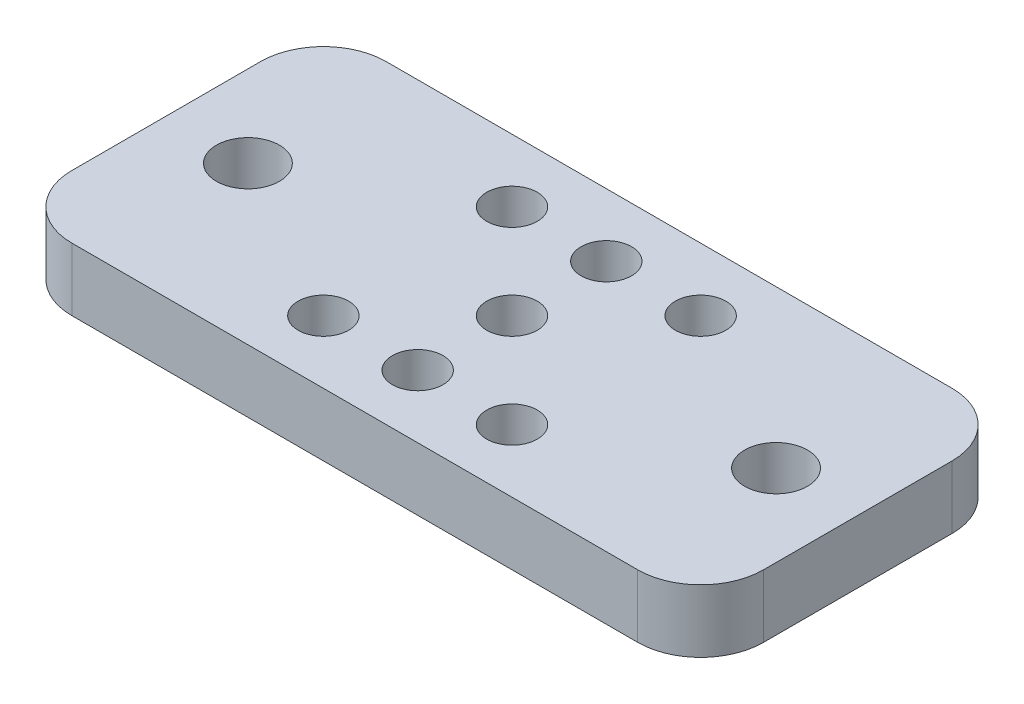
ISO-10303-21;
HEADER;
FILE_DESCRIPTION(('STEP AP214'),'2;1');
FILE_NAME('part.step','',(''),(''),'','','');
FILE_SCHEMA(('AUTOMOTIVE_DESIGN { 1 0 10303 214 1 1 1 1 }'));
ENDSEC;
DATA;
#1=APPLICATION_CONTEXT('core data for automotive mechanical design processes');
#2=APPLICATION_PROTOCOL_DEFINITION('international standard','automotive_design',2000,#1);
#3=PRODUCT_CONTEXT('',#1,'mechanical');
#4=PRODUCT('Part','Part','',(#3));
#5=PRODUCT_RELATED_PRODUCT_CATEGORY('part','',(#4));
#6=PRODUCT_DEFINITION_FORMATION('','',#4);
#7=PRODUCT_DEFINITION_CONTEXT('part definition',#1,'design');
#8=PRODUCT_DEFINITION('design','',#6,#7);
#9=PRODUCT_DEFINITION_SHAPE('','',#8);
#10=(LENGTH_UNIT() NAMED_UNIT(*) SI_UNIT(.MILLI.,.METRE.));
#11=(NAMED_UNIT(*) PLANE_ANGLE_UNIT() SI_UNIT($,.RADIAN.));
#12=(NAMED_UNIT(*) SI_UNIT($,.STERADIAN.) SOLID_ANGLE_UNIT());
#13=UNCERTAINTY_MEASURE_WITH_UNIT(LENGTH_MEASURE(1.E-05),#10,'distance_accuracy_value','');
#14=(GEOMETRIC_REPRESENTATION_CONTEXT(3) GLOBAL_UNCERTAINTY_ASSIGNED_CONTEXT((#13)) GLOBAL_UNIT_ASSIGNED_CONTEXT((#10,
#11,#12)) REPRESENTATION_CONTEXT('',''));
#15=CARTESIAN_POINT('',(0.,0.,0.));
#16=DIRECTION('',(0.,0.,1.));
#17=DIRECTION('',(1.,0.,0.));
#18=AXIS2_PLACEMENT_3D('',#15,#16,#17);
#19=CARTESIAN_POINT('',(-34.925,6.35,-15.875));
#20=DIRECTION('',(0.,0.,-1.));
#21=DIRECTION('',(-1.,0.,0.));
#22=AXIS2_PLACEMENT_3D('',#19,#20,#21);
#23=PLANE('',#22);
#24=DIRECTION('',(1.,0.,0.));
#25=VECTOR('',#24,1.);
#26=CARTESIAN_POINT('',(-34.925,6.35,-15.875));
#27=LINE('',#26,#25);
#28=CARTESIAN_POINT('',(-28.575,6.35,-15.875));
#29=VERTEX_POINT('',#28);
#30=CARTESIAN_POINT('',(28.575,6.35,-15.875));
#31=VERTEX_POINT('',#30);
#32=EDGE_CURVE('E262',#29,#31,#27,.T.);
#33=ORIENTED_EDGE('',*,*,#32,.T.);
#34=DIRECTION('',(0.,-1.,0.));
#35=VECTOR('',#34,1.);
#36=CARTESIAN_POINT('',(28.575,6.35,-15.875));
#37=LINE('',#36,#35);
#38=CARTESIAN_POINT('',(28.575,0.,-15.875));
#39=VERTEX_POINT('',#38);
#40=EDGE_CURVE('E417',#31,#39,#37,.T.);
#41=ORIENTED_EDGE('',*,*,#40,.T.);
#42=DIRECTION('',(1.,0.,0.));
#43=VECTOR('',#42,1.);
#44=CARTESIAN_POINT('',(-34.925,0.,-15.875));
#45=LINE('',#44,#43);
#46=CARTESIAN_POINT('',(-28.575,0.,-15.875));
#47=VERTEX_POINT('',#46);
#48=EDGE_CURVE('E269',#47,#39,#45,.T.);
#49=ORIENTED_EDGE('',*,*,#48,.F.);
#50=DIRECTION('',(0.,-1.,0.));
#51=VECTOR('',#50,1.);
#52=CARTESIAN_POINT('',(-28.575,6.35,-15.875));
#53=LINE('',#52,#51);
#54=EDGE_CURVE('E145',#47,#29,#53,.F.);
#55=ORIENTED_EDGE('',*,*,#54,.T.);
#56=EDGE_LOOP('',(#33,#41,#49,#55));
#57=FACE_BOUND('',#56,.T.);
#58=ADVANCED_FACE('F35',(#57),#23,.T.);
#59=CARTESIAN_POINT('',(-34.925,6.35,15.875));
#60=DIRECTION('',(-1.,0.,0.));
#61=DIRECTION('',(0.,0.,1.));
#62=AXIS2_PLACEMENT_3D('',#59,#60,#61);
#63=PLANE('',#62);
#64=DIRECTION('',(0.,0.,-1.));
#65=VECTOR('',#64,1.);
#66=CARTESIAN_POINT('',(-34.925,6.35,15.875));
#67=LINE('',#66,#65);
#68=CARTESIAN_POINT('',(-34.925,6.35,9.52500000000001));
#69=VERTEX_POINT('',#68);
#70=CARTESIAN_POINT('',(-34.925,6.35,-9.525));
#71=VERTEX_POINT('',#70);
#72=EDGE_CURVE('E258',#69,#71,#67,.T.);
#73=ORIENTED_EDGE('',*,*,#72,.T.);
#74=DIRECTION('',(0.,-1.,0.));
#75=VECTOR('',#74,1.);
#76=CARTESIAN_POINT('',(-34.925,6.35,-9.525));
#77=LINE('',#76,#75);
#78=CARTESIAN_POINT('',(-34.925,0.,-9.525));
#79=VERTEX_POINT('',#78);
#80=EDGE_CURVE('E404',#71,#79,#77,.T.);
#81=ORIENTED_EDGE('',*,*,#80,.T.);
#82=DIRECTION('',(0.,0.,-1.));
#83=VECTOR('',#82,1.);
#84=CARTESIAN_POINT('',(-34.925,0.,15.875));
#85=LINE('',#84,#83);
#86=CARTESIAN_POINT('',(-34.925,0.,9.52500000000001));
#87=VERTEX_POINT('',#86);
#88=EDGE_CURVE('E259',#87,#79,#85,.T.);
#89=ORIENTED_EDGE('',*,*,#88,.F.);
#90=DIRECTION('',(0.,-1.,0.));
#91=VECTOR('',#90,1.);
#92=CARTESIAN_POINT('',(-34.925,6.35,9.52500000000001));
#93=LINE('',#92,#91);
#94=EDGE_CURVE('E402',#87,#69,#93,.F.);
#95=ORIENTED_EDGE('',*,*,#94,.T.);
#96=EDGE_LOOP('',(#73,#81,#89,#95));
#97=FACE_BOUND('',#96,.T.);
#98=ADVANCED_FACE('F360',(#97),#63,.T.);
#99=CARTESIAN_POINT('',(34.925,6.35,15.875));
#100=DIRECTION('',(0.,0.,1.));
#101=DIRECTION('',(1.,0.,0.));
#102=AXIS2_PLACEMENT_3D('',#99,#100,#101);
#103=PLANE('',#102);
#104=DIRECTION('',(-1.,0.,0.));
#105=VECTOR('',#104,1.);
#106=CARTESIAN_POINT('',(34.925,0.,15.875));
#107=LINE('',#106,#105);
#108=CARTESIAN_POINT('',(28.575,0.,15.875));
#109=VERTEX_POINT('',#108);
#110=CARTESIAN_POINT('',(-28.575,0.,15.875));
#111=VERTEX_POINT('',#110);
#112=EDGE_CURVE('E263',#109,#111,#107,.T.);
#113=ORIENTED_EDGE('',*,*,#112,.F.);
#114=DIRECTION('',(0.,-1.,0.));
#115=VECTOR('',#114,1.);
#116=CARTESIAN_POINT('',(28.575,6.35,15.875));
#117=LINE('',#116,#115);
#118=CARTESIAN_POINT('',(28.575,6.35,15.875));
#119=VERTEX_POINT('',#118);
#120=EDGE_CURVE('E11',#109,#119,#117,.F.);
#121=ORIENTED_EDGE('',*,*,#120,.T.);
#122=DIRECTION('',(-1.,0.,0.));
#123=VECTOR('',#122,1.);
#124=CARTESIAN_POINT('',(34.925,6.35,15.875));
#125=LINE('',#124,#123);
#126=CARTESIAN_POINT('',(-28.575,6.35,15.875));
#127=VERTEX_POINT('',#126);
#128=EDGE_CURVE('E275',#119,#127,#125,.T.);
#129=ORIENTED_EDGE('',*,*,#128,.T.);
#130=DIRECTION('',(0.,-1.,0.));
#131=VECTOR('',#130,1.);
#132=CARTESIAN_POINT('',(-28.575,6.35,15.875));
#133=LINE('',#132,#131);
#134=EDGE_CURVE('E43',#127,#111,#133,.T.);
#135=ORIENTED_EDGE('',*,*,#134,.T.);
#136=EDGE_LOOP('',(#113,#121,#129,#135));
#137=FACE_BOUND('',#136,.T.);
#138=ADVANCED_FACE('F363',(#137),#103,.T.);
#139=CARTESIAN_POINT('',(34.925,6.35,-15.875));
#140=DIRECTION('',(1.,0.,0.));
#141=DIRECTION('',(0.,0.,-1.));
#142=AXIS2_PLACEMENT_3D('',#139,#140,#141);
#143=PLANE('',#142);
#144=DIRECTION('',(0.,0.,1.));
#145=VECTOR('',#144,1.);
#146=CARTESIAN_POINT('',(34.925,0.,-15.875));
#147=LINE('',#146,#145);
#148=CARTESIAN_POINT('',(34.925,0.,-9.525));
#149=VERTEX_POINT('',#148);
#150=CARTESIAN_POINT('',(34.925,0.,9.525));
#151=VERTEX_POINT('',#150);
#152=EDGE_CURVE('E266',#149,#151,#147,.T.);
#153=ORIENTED_EDGE('',*,*,#152,.F.);
#154=DIRECTION('',(0.,-1.,0.));
#155=VECTOR('',#154,1.);
#156=CARTESIAN_POINT('',(34.925,6.35,-9.525));
#157=LINE('',#156,#155);
#158=CARTESIAN_POINT('',(34.925,6.35,-9.525));
#159=VERTEX_POINT('',#158);
#160=EDGE_CURVE('E397',#149,#159,#157,.F.);
#161=ORIENTED_EDGE('',*,*,#160,.T.);
#162=DIRECTION('',(0.,0.,1.));
#163=VECTOR('',#162,1.);
#164=CARTESIAN_POINT('',(34.925,6.35,-15.875));
#165=LINE('',#164,#163);
#166=CARTESIAN_POINT('',(34.925,6.35,9.525));
#167=VERTEX_POINT('',#166);
#168=EDGE_CURVE('E277',#159,#167,#165,.T.);
#169=ORIENTED_EDGE('',*,*,#168,.T.);
#170=DIRECTION('',(0.,-1.,0.));
#171=VECTOR('',#170,1.);
#172=CARTESIAN_POINT('',(34.925,6.35,9.525));
#173=LINE('',#172,#171);
#174=EDGE_CURVE('E391',#167,#151,#173,.T.);
#175=ORIENTED_EDGE('',*,*,#174,.T.);
#176=EDGE_LOOP('',(#153,#161,#169,#175));
#177=FACE_BOUND('',#176,.T.);
#178=ADVANCED_FACE('F356',(#177),#143,.T.);
#179=CARTESIAN_POINT('',(0.,6.35,0.));
#180=DIRECTION('',(0.,-1.,0.));
#181=DIRECTION('',(0.,0.,-1.));
#182=AXIS2_PLACEMENT_3D('',#179,#180,#181);
#183=PLANE('',#182);
#184=CARTESIAN_POINT('',(0.,6.34999999999999,0.));
#185=DIRECTION('',(0.,-1.,0.));
#186=DIRECTION('',(0.,0.,-1.));
#187=AXIS2_PLACEMENT_3D('',#184,#185,#186);
#188=CIRCLE('',#187,2.55269999999999);
#189=CARTESIAN_POINT('',(0.,6.34999999999999,-2.55269999999999));
#190=VERTEX_POINT('',#189);
#191=EDGE_CURVE('E172',#190,#190,#188,.T.);
#192=ORIENTED_EDGE('',*,*,#191,.T.);
#193=EDGE_LOOP('',(#192));
#194=FACE_BOUND('',#193,.T.);
#195=CARTESIAN_POINT('',(0.,6.34999999999999,-9.525));
#196=DIRECTION('',(0.,-1.,0.));
#197=DIRECTION('',(0.,0.,-1.));
#198=AXIS2_PLACEMENT_3D('',#195,#196,#197);
#199=CIRCLE('',#198,2.55269999999999);
#200=CARTESIAN_POINT('',(0.,6.34999999999999,-12.0777));
#201=VERTEX_POINT('',#200);
#202=EDGE_CURVE('E167',#201,#201,#199,.T.);
#203=ORIENTED_EDGE('',*,*,#202,.T.);
#204=EDGE_LOOP('',(#203));
#205=FACE_BOUND('',#204,.T.);
#206=CARTESIAN_POINT('',(0.,6.34999999999999,9.525));
#207=DIRECTION('',(0.,-1.,0.));
#208=DIRECTION('',(0.,0.,-1.));
#209=AXIS2_PLACEMENT_3D('',#206,#207,#208);
#210=CIRCLE('',#209,2.55269999999999);
#211=CARTESIAN_POINT('',(0.,6.34999999999999,6.97230000000001));
#212=VERTEX_POINT('',#211);
#213=EDGE_CURVE('E335',#212,#212,#210,.T.);
#214=ORIENTED_EDGE('',*,*,#213,.T.);
#215=EDGE_LOOP('',(#214));
#216=FACE_BOUND('',#215,.T.);
#217=CARTESIAN_POINT('',(-9.525,6.34999999999999,-9.525));
#218=DIRECTION('',(0.,-1.,0.));
#219=DIRECTION('',(0.,0.,-1.));
#220=AXIS2_PLACEMENT_3D('',#217,#218,#219);
#221=CIRCLE('',#220,2.55269999999999);
#222=CARTESIAN_POINT('',(-9.525,6.34999999999999,-12.0777));
#223=VERTEX_POINT('',#222);
#224=EDGE_CURVE('E319',#223,#223,#221,.T.);
#225=ORIENTED_EDGE('',*,*,#224,.T.);
#226=EDGE_LOOP('',(#225));
#227=FACE_BOUND('',#226,.T.);
#228=CARTESIAN_POINT('',(9.525,6.34999999999999,-9.525));
#229=DIRECTION('',(0.,-1.,0.));
#230=DIRECTION('',(0.,0.,-1.));
#231=AXIS2_PLACEMENT_3D('',#228,#229,#230);
#232=CIRCLE('',#231,2.55269999999999);
#233=CARTESIAN_POINT('',(9.525,6.34999999999999,-12.0777));
#234=VERTEX_POINT('',#233);
#235=EDGE_CURVE('E311',#234,#234,#232,.T.);
#236=ORIENTED_EDGE('',*,*,#235,.T.);
#237=EDGE_LOOP('',(#236));
#238=FACE_BOUND('',#237,.T.);
#239=CARTESIAN_POINT('',(9.525,6.34999999999999,9.525));
#240=DIRECTION('',(0.,-1.,0.));
#241=DIRECTION('',(0.,0.,-1.));
#242=AXIS2_PLACEMENT_3D('',#239,#240,#241);
#243=CIRCLE('',#242,2.55269999999999);
#244=CARTESIAN_POINT('',(9.525,6.34999999999999,6.97230000000001));
#245=VERTEX_POINT('',#244);
#246=EDGE_CURVE('E302',#245,#245,#243,.T.);
#247=ORIENTED_EDGE('',*,*,#246,.T.);
#248=EDGE_LOOP('',(#247));
#249=FACE_BOUND('',#248,.T.);
#250=CARTESIAN_POINT('',(-9.525,6.34999999999999,9.525));
#251=DIRECTION('',(0.,-1.,0.));
#252=DIRECTION('',(0.,0.,-1.));
#253=AXIS2_PLACEMENT_3D('',#250,#251,#252);
#254=CIRCLE('',#253,2.55269999999999);
#255=CARTESIAN_POINT('',(-9.525,6.34999999999999,6.97230000000001));
#256=VERTEX_POINT('',#255);
#257=EDGE_CURVE('E293',#256,#256,#254,.T.);
#258=ORIENTED_EDGE('',*,*,#257,.T.);
#259=EDGE_LOOP('',(#258));
#260=FACE_BOUND('',#259,.T.);
#261=CARTESIAN_POINT('',(26.67,6.35,0.));
#262=DIRECTION('',(0.,1.,0.));
#263=DIRECTION('',(0.,0.,1.));
#264=AXIS2_PLACEMENT_3D('',#261,#262,#263);
#265=CIRCLE('',#264,3.17500000000001);
#266=CARTESIAN_POINT('',(26.67,6.35,3.17500000000002));
#267=VERTEX_POINT('',#266);
#268=EDGE_CURVE('E290',#267,#267,#265,.T.);
#269=ORIENTED_EDGE('',*,*,#268,.F.);
#270=EDGE_LOOP('',(#269));
#271=FACE_BOUND('',#270,.T.);
#272=CARTESIAN_POINT('',(-26.67,6.35,0.));
#273=DIRECTION('',(0.,1.,0.));
#274=DIRECTION('',(0.,0.,1.));
#275=AXIS2_PLACEMENT_3D('',#272,#273,#274);
#276=CIRCLE('',#275,3.17500000000001);
#277=CARTESIAN_POINT('',(-26.67,6.35,3.17500000000002));
#278=VERTEX_POINT('',#277);
#279=EDGE_CURVE('E284',#278,#278,#276,.T.);
#280=ORIENTED_EDGE('',*,*,#279,.F.);
#281=EDGE_LOOP('',(#280));
#282=FACE_BOUND('',#281,.T.);
#283=ORIENTED_EDGE('',*,*,#168,.F.);
#284=CARTESIAN_POINT('',(28.575,6.35,-9.525));
#285=DIRECTION('',(0.,-1.,0.));
#286=DIRECTION('',(0.,0.,-1.));
#287=AXIS2_PLACEMENT_3D('',#284,#285,#286);
#288=CIRCLE('',#287,6.35);
#289=EDGE_CURVE('E395',#159,#31,#288,.F.);
#290=ORIENTED_EDGE('',*,*,#289,.T.);
#291=ORIENTED_EDGE('',*,*,#32,.F.);
#292=CARTESIAN_POINT('',(-28.575,6.35,-9.525));
#293=DIRECTION('',(0.,-1.,0.));
#294=DIRECTION('',(0.,0.,-1.));
#295=AXIS2_PLACEMENT_3D('',#292,#293,#294);
#296=CIRCLE('',#295,6.35);
#297=EDGE_CURVE('E393',#29,#71,#296,.F.);
#298=ORIENTED_EDGE('',*,*,#297,.T.);
#299=ORIENTED_EDGE('',*,*,#72,.F.);
#300=CARTESIAN_POINT('',(-28.575,6.35,9.52500000000001));
#301=DIRECTION('',(0.,-1.,0.));
#302=DIRECTION('',(0.,0.,-1.));
#303=AXIS2_PLACEMENT_3D('',#300,#301,#302);
#304=CIRCLE('',#303,6.35);
#305=EDGE_CURVE('E50',#69,#127,#304,.F.);
#306=ORIENTED_EDGE('',*,*,#305,.T.);
#307=ORIENTED_EDGE('',*,*,#128,.F.);
#308=CARTESIAN_POINT('',(28.575,6.35,9.525));
#309=DIRECTION('',(0.,-1.,0.));
#310=DIRECTION('',(0.,0.,-1.));
#311=AXIS2_PLACEMENT_3D('',#308,#309,#310);
#312=CIRCLE('',#311,6.35);
#313=EDGE_CURVE('E389',#119,#167,#312,.F.);
#314=ORIENTED_EDGE('',*,*,#313,.T.);
#315=EDGE_LOOP('',(#283,#290,#291,#298,#299,#306,#307,#314));
#316=FACE_BOUND('',#315,.T.);
#317=ADVANCED_FACE('F353',(#194,#205,#216,#227,#238,#249,#260,#271,#282,#316),#183,.F.);
#318=CARTESIAN_POINT('',(0.,0.,0.));
#319=DIRECTION('',(0.,-1.,0.));
#320=DIRECTION('',(0.,0.,-1.));
#321=AXIS2_PLACEMENT_3D('',#318,#319,#320);
#322=PLANE('',#321);
#323=CARTESIAN_POINT('',(0.,0.,0.));
#324=DIRECTION('',(0.,-1.,0.));
#325=DIRECTION('',(0.,0.,-1.));
#326=AXIS2_PLACEMENT_3D('',#323,#324,#325);
#327=CIRCLE('',#326,4.88949999999022);
#328=CARTESIAN_POINT('',(1.10716033161614,0.,-4.7625));
#329=VERTEX_POINT('',#328);
#330=CARTESIAN_POINT('',(1.10716033161614,0.,4.7625));
#331=VERTEX_POINT('',#330);
#332=EDGE_CURVE('E138',#329,#331,#327,.T.);
#333=ORIENTED_EDGE('',*,*,#332,.F.);
#334=CARTESIAN_POINT('',(0.,0.,-9.525));
#335=DIRECTION('',(0.,-1.,0.));
#336=DIRECTION('',(0.,0.,-1.));
#337=AXIS2_PLACEMENT_3D('',#334,#335,#336);
#338=CIRCLE('',#337,4.88949999999022);
#339=CARTESIAN_POINT('',(4.7625,0.,-8.41783966838386));
#340=VERTEX_POINT('',#339);
#341=EDGE_CURVE('E154',#340,#329,#338,.T.);
#342=ORIENTED_EDGE('',*,*,#341,.F.);
#343=CARTESIAN_POINT('',(9.525,0.,-9.525));
#344=DIRECTION('',(0.,-1.,0.));
#345=DIRECTION('',(0.,0.,-1.));
#346=AXIS2_PLACEMENT_3D('',#343,#344,#345);
#347=CIRCLE('',#346,4.88949999999022);
#348=CARTESIAN_POINT('',(4.7625,0.,-10.6321603316161));
#349=VERTEX_POINT('',#348);
#350=EDGE_CURVE('E317',#349,#340,#347,.T.);
#351=ORIENTED_EDGE('',*,*,#350,.F.);
#352=CARTESIAN_POINT('',(-4.7625,0.,-10.6321603316161));
#353=VERTEX_POINT('',#352);
#354=EDGE_CURVE('E165',#353,#349,#338,.T.);
#355=ORIENTED_EDGE('',*,*,#354,.F.);
#356=CARTESIAN_POINT('',(-9.525,0.,-9.525));
#357=DIRECTION('',(0.,-1.,0.));
#358=DIRECTION('',(0.,0.,-1.));
#359=AXIS2_PLACEMENT_3D('',#356,#357,#358);
#360=CIRCLE('',#359,4.88949999999022);
#361=CARTESIAN_POINT('',(-4.76250000000003,0.,-8.41783966838397));
#362=VERTEX_POINT('',#361);
#363=EDGE_CURVE('E325',#362,#353,#360,.T.);
#364=ORIENTED_EDGE('',*,*,#363,.F.);
#365=CARTESIAN_POINT('',(-1.10716033161614,0.,-4.7625));
#366=VERTEX_POINT('',#365);
#367=EDGE_CURVE('E163',#366,#362,#338,.T.);
#368=ORIENTED_EDGE('',*,*,#367,.F.);
#369=CARTESIAN_POINT('',(-1.10716033161614,0.,4.7625));
#370=VERTEX_POINT('',#369);
#371=EDGE_CURVE('E141',#370,#366,#327,.T.);
#372=ORIENTED_EDGE('',*,*,#371,.F.);
#373=CARTESIAN_POINT('',(0.,0.,9.525));
#374=DIRECTION('',(0.,-1.,0.));
#375=DIRECTION('',(0.,0.,-1.));
#376=AXIS2_PLACEMENT_3D('',#373,#374,#375);
#377=CIRCLE('',#376,4.88949999999022);
#378=CARTESIAN_POINT('',(-4.7625,0.,8.41783966838386));
#379=VERTEX_POINT('',#378);
#380=EDGE_CURVE('E225',#379,#370,#377,.T.);
#381=ORIENTED_EDGE('',*,*,#380,.F.);
#382=CARTESIAN_POINT('',(-9.525,0.,9.525));
#383=DIRECTION('',(0.,-1.,0.));
#384=DIRECTION('',(0.,0.,-1.));
#385=AXIS2_PLACEMENT_3D('',#382,#383,#384);
#386=CIRCLE('',#385,4.88949999999022);
#387=CARTESIAN_POINT('',(-4.76250000000002,0.,10.632160331616));
#388=VERTEX_POINT('',#387);
#389=EDGE_CURVE('E299',#388,#379,#386,.T.);
#390=ORIENTED_EDGE('',*,*,#389,.F.);
#391=CARTESIAN_POINT('',(4.7625,0.,10.6321603316161));
#392=VERTEX_POINT('',#391);
#393=EDGE_CURVE('E601',#392,#388,#377,.T.);
#394=ORIENTED_EDGE('',*,*,#393,.F.);
#395=CARTESIAN_POINT('',(9.525,0.,9.525));
#396=DIRECTION('',(0.,-1.,0.));
#397=DIRECTION('',(0.,0.,-1.));
#398=AXIS2_PLACEMENT_3D('',#395,#396,#397);
#399=CIRCLE('',#398,4.88949999999022);
#400=CARTESIAN_POINT('',(4.7625,0.,8.41783966838386));
#401=VERTEX_POINT('',#400);
#402=EDGE_CURVE('E308',#401,#392,#399,.T.);
#403=ORIENTED_EDGE('',*,*,#402,.F.);
#404=EDGE_CURVE('E157',#331,#401,#377,.T.);
#405=ORIENTED_EDGE('',*,*,#404,.F.);
#406=EDGE_LOOP('',(#333,#342,#351,#355,#364,#368,#372,#381,#390,#394,#403,#405));
#407=FACE_BOUND('',#406,.T.);
#408=CARTESIAN_POINT('',(26.67,0.,0.));
#409=DIRECTION('',(0.,1.,0.));
#410=DIRECTION('',(0.,0.,1.));
#411=AXIS2_PLACEMENT_3D('',#408,#409,#410);
#412=CIRCLE('',#411,3.17500000000001);
#413=CARTESIAN_POINT('',(26.67,0.,3.17500000000002));
#414=VERTEX_POINT('',#413);
#415=EDGE_CURVE('E287',#414,#414,#412,.T.);
#416=ORIENTED_EDGE('',*,*,#415,.T.);
#417=EDGE_LOOP('',(#416));
#418=FACE_BOUND('',#417,.T.);
#419=CARTESIAN_POINT('',(-26.67,0.,0.));
#420=DIRECTION('',(0.,1.,0.));
#421=DIRECTION('',(0.,0.,1.));
#422=AXIS2_PLACEMENT_3D('',#419,#420,#421);
#423=CIRCLE('',#422,3.17500000000001);
#424=CARTESIAN_POINT('',(-26.67,0.,3.17500000000002));
#425=VERTEX_POINT('',#424);
#426=EDGE_CURVE('E272',#425,#425,#423,.T.);
#427=ORIENTED_EDGE('',*,*,#426,.T.);
#428=EDGE_LOOP('',(#427));
#429=FACE_BOUND('',#428,.T.);
#430=ORIENTED_EDGE('',*,*,#48,.T.);
#431=CARTESIAN_POINT('',(28.575,0.,-9.525));
#432=DIRECTION('',(0.,-1.,0.));
#433=DIRECTION('',(0.,0.,-1.));
#434=AXIS2_PLACEMENT_3D('',#431,#432,#433);
#435=CIRCLE('',#434,6.35);
#436=EDGE_CURVE('E415',#39,#149,#435,.T.);
#437=ORIENTED_EDGE('',*,*,#436,.T.);
#438=ORIENTED_EDGE('',*,*,#152,.T.);
#439=CARTESIAN_POINT('',(28.575,0.,9.525));
#440=DIRECTION('',(0.,-1.,0.));
#441=DIRECTION('',(0.,0.,-1.));
#442=AXIS2_PLACEMENT_3D('',#439,#440,#441);
#443=CIRCLE('',#442,6.35);
#444=EDGE_CURVE('E411',#151,#109,#443,.T.);
#445=ORIENTED_EDGE('',*,*,#444,.T.);
#446=ORIENTED_EDGE('',*,*,#112,.T.);
#447=CARTESIAN_POINT('',(-28.575,0.,9.52500000000001));
#448=DIRECTION('',(0.,-1.,0.));
#449=DIRECTION('',(0.,0.,-1.));
#450=AXIS2_PLACEMENT_3D('',#447,#448,#449);
#451=CIRCLE('',#450,6.35);
#452=EDGE_CURVE('E409',#111,#87,#451,.T.);
#453=ORIENTED_EDGE('',*,*,#452,.T.);
#454=ORIENTED_EDGE('',*,*,#88,.T.);
#455=CARTESIAN_POINT('',(-28.575,0.,-9.525));
#456=DIRECTION('',(0.,-1.,0.));
#457=DIRECTION('',(0.,0.,-1.));
#458=AXIS2_PLACEMENT_3D('',#455,#456,#457);
#459=CIRCLE('',#458,6.35);
#460=EDGE_CURVE('E413',#79,#47,#459,.T.);
#461=ORIENTED_EDGE('',*,*,#460,.T.);
#462=EDGE_LOOP('',(#430,#437,#438,#445,#446,#453,#454,#461));
#463=FACE_BOUND('',#462,.T.);
#464=ADVANCED_FACE('F151',(#407,#418,#429,#463),#322,.T.);
#465=CARTESIAN_POINT('',(-26.67,6.35,0.));
#466=DIRECTION('',(0.,1.,0.));
#467=DIRECTION('',(0.,0.,1.));
#468=AXIS2_PLACEMENT_3D('',#465,#466,#467);
#469=CYLINDRICAL_SURFACE('',#468,3.17500000000001);
#470=ORIENTED_EDGE('',*,*,#426,.F.);
#471=EDGE_LOOP('',(#470));
#472=FACE_BOUND('',#471,.T.);
#473=ORIENTED_EDGE('',*,*,#279,.T.);
#474=EDGE_LOOP('',(#473));
#475=FACE_BOUND('',#474,.T.);
#476=ADVANCED_FACE('F348',(#472,#475),#469,.F.);
#477=CARTESIAN_POINT('',(26.67,6.35,0.));
#478=DIRECTION('',(0.,1.,0.));
#479=DIRECTION('',(0.,0.,1.));
#480=AXIS2_PLACEMENT_3D('',#477,#478,#479);
#481=CYLINDRICAL_SURFACE('',#480,3.17500000000001);
#482=ORIENTED_EDGE('',*,*,#415,.F.);
#483=EDGE_LOOP('',(#482));
#484=FACE_BOUND('',#483,.T.);
#485=ORIENTED_EDGE('',*,*,#268,.T.);
#486=EDGE_LOOP('',(#485));
#487=FACE_BOUND('',#486,.T.);
#488=ADVANCED_FACE('F344',(#484,#487),#481,.F.);
#489=CARTESIAN_POINT('',(-9.525,0.,9.525));
#490=DIRECTION('',(0.,-1.,0.));
#491=DIRECTION('',(0.,0.,-1.));
#492=AXIS2_PLACEMENT_3D('',#489,#490,#491);
#493=CYLINDRICAL_SURFACE('',#492,2.5527);
#494=ORIENTED_EDGE('',*,*,#257,.F.);
#495=EDGE_LOOP('',(#494));
#496=FACE_BOUND('',#495,.T.);
#497=CARTESIAN_POINT('',(-9.525,1.96080801814062,9.525));
#498=DIRECTION('',(0.,-1.,0.));
#499=DIRECTION('',(0.,0.,-1.));
#500=AXIS2_PLACEMENT_3D('',#497,#498,#499);
#501=CIRCLE('',#500,2.55270000000001);
#502=CARTESIAN_POINT('',(-9.525,1.96080801814062,6.97229999999999));
#503=VERTEX_POINT('',#502);
#504=EDGE_CURVE('E296',#503,#503,#501,.T.);
#505=ORIENTED_EDGE('',*,*,#504,.T.);
#506=EDGE_LOOP('',(#505));
#507=FACE_BOUND('',#506,.T.);
#508=ADVANCED_FACE('F340',(#496,#507),#493,.F.);
#509=CARTESIAN_POINT('',(-9.525,0.,9.525));
#510=DIRECTION('',(0.,-1.,0.));
#511=DIRECTION('',(0.,0.,-1.));
#512=AXIS2_PLACEMENT_3D('',#509,#510,#511);
#513=CONICAL_SURFACE('',#512,4.88949999999022,0.872664625993708);
#514=ORIENTED_EDGE('',*,*,#504,.F.);
#515=EDGE_LOOP('',(#514));
#516=FACE_BOUND('',#515,.T.);
#517=ORIENTED_EDGE('',*,*,#389,.T.);
#518=CARTESIAN_POINT('',(-4.7625,-0.000200000000001076,8.41678752561081));
#519=CARTESIAN_POINT('',(-4.7625,0.0153730405917863,8.49865983775453));
#520=CARTESIAN_POINT('',(-4.7625,0.0293585007487221,8.58082912586477));
#521=CARTESIAN_POINT('',(-4.7625,0.0539876080195875,8.7456789095902));
#522=CARTESIAN_POINT('',(-4.7625,0.0646307403019222,8.8283594819624));
#523=CARTESIAN_POINT('',(-4.7625,0.0912911007571808,9.07701541144557));
#524=CARTESIAN_POINT('',(-4.7625,0.10203748376683,9.24359565189882));
#525=CARTESIAN_POINT('',(-4.7625,0.108724480415409,9.5744453592199));
#526=CARTESIAN_POINT('',(-4.7625,0.104892031804984,9.73871061623207));
#527=CARTESIAN_POINT('',(-4.7625,0.0831756592166563,10.0662126369859));
#528=CARTESIAN_POINT('',(-4.7625,0.0653013665610762,10.2294500284118));
#529=CARTESIAN_POINT('',(-4.7625,0.0348780388586519,10.4319973684652));
#530=CARTESIAN_POINT('',(-4.7625,0.0284152210214396,10.4722861697214));
#531=CARTESIAN_POINT('',(-4.7625,0.0146959517364772,10.5528104875079));
#532=CARTESIAN_POINT('',(-4.7625,0.00743795594223331,10.5930457410602));
#533=CARTESIAN_POINT('',(-4.7625,-0.000200000000001379,10.6332124743892));
#534=B_SPLINE_CURVE_WITH_KNOTS('',3,(#518,#519,#520,#521,#522,#523,#524,#525,#526,#527,#528,
#529,#530,#531,#532,#533),.UNSPECIFIED.,.F.,.F.,(4,2,2,2,2,2,2,4),(0.,0.249991755182296,
0.500021998688195,1.0001109050321,1.49244739172985,1.98444647860825,2.10685444276423,
2.22950450196478),.UNSPECIFIED.);
#535=EDGE_CURVE('E328',#379,#388,#534,.T.);
#536=ORIENTED_EDGE('',*,*,#535,.T.);
#537=EDGE_LOOP('',(#517,#536));
#538=FACE_BOUND('',#537,.T.);
#539=ADVANCED_FACE('F336',(#516,#538),#513,.F.);
#540=CARTESIAN_POINT('',(9.525,0.,9.525));
#541=DIRECTION('',(0.,-1.,0.));
#542=DIRECTION('',(0.,0.,-1.));
#543=AXIS2_PLACEMENT_3D('',#540,#541,#542);
#544=CYLINDRICAL_SURFACE('',#543,2.5527);
#545=ORIENTED_EDGE('',*,*,#246,.F.);
#546=EDGE_LOOP('',(#545));
#547=FACE_BOUND('',#546,.T.);
#548=CARTESIAN_POINT('',(9.525,1.96080801814062,9.525));
#549=DIRECTION('',(0.,-1.,0.));
#550=DIRECTION('',(0.,0.,-1.));
#551=AXIS2_PLACEMENT_3D('',#548,#549,#550);
#552=CIRCLE('',#551,2.55270000000001);
#553=CARTESIAN_POINT('',(9.525,1.96080801814062,6.9723));
#554=VERTEX_POINT('',#553);
#555=EDGE_CURVE('E305',#554,#554,#552,.T.);
#556=ORIENTED_EDGE('',*,*,#555,.T.);
#557=EDGE_LOOP('',(#556));
#558=FACE_BOUND('',#557,.T.);
#559=ADVANCED_FACE('F248',(#547,#558),#544,.F.);
#560=CARTESIAN_POINT('',(9.525,0.,9.525));
#561=DIRECTION('',(0.,-1.,0.));
#562=DIRECTION('',(0.,0.,-1.));
#563=AXIS2_PLACEMENT_3D('',#560,#561,#562);
#564=CONICAL_SURFACE('',#563,4.88949999999022,0.872664625993708);
#565=ORIENTED_EDGE('',*,*,#555,.F.);
#566=EDGE_LOOP('',(#565));
#567=FACE_BOUND('',#566,.T.);
#568=ORIENTED_EDGE('',*,*,#402,.T.);
#569=CARTESIAN_POINT('',(4.7625,-0.000200000000001428,10.6332124743892));
#570=CARTESIAN_POINT('',(4.7625,0.0153730405917862,10.5513401622455));
#571=CARTESIAN_POINT('',(4.7625,0.0293585007487221,10.4691708741352));
#572=CARTESIAN_POINT('',(4.7625,0.0539876080195877,10.3043210904098));
#573=CARTESIAN_POINT('',(4.7625,0.0646307403019225,10.2216405180376));
#574=CARTESIAN_POINT('',(4.7625,0.0912911007571812,9.97298458855443));
#575=CARTESIAN_POINT('',(4.7625,0.102037483766831,9.80640434810118));
#576=CARTESIAN_POINT('',(4.7625,0.10872448041541,9.47555464078011));
#577=CARTESIAN_POINT('',(4.7625,0.104892031804984,9.31128938376794));
#578=CARTESIAN_POINT('',(4.7625,0.0831756592166572,8.98378736301411));
#579=CARTESIAN_POINT('',(4.7625,0.0653013665610773,8.82054997158825));
#580=CARTESIAN_POINT('',(4.7625,0.0348780388586529,8.6180026315348));
#581=CARTESIAN_POINT('',(4.7625,0.0284152210214404,8.57771383027856));
#582=CARTESIAN_POINT('',(4.7625,0.0146959517364777,8.49718951249206));
#583=CARTESIAN_POINT('',(4.7625,0.00743795594223357,8.45695425893979));
#584=CARTESIAN_POINT('',(4.7625,-0.000200000000001379,8.41678752561081));
#585=B_SPLINE_CURVE_WITH_KNOTS('',3,(#569,#570,#571,#572,#573,#574,#575,#576,#577,#578,#579,
#580,#581,#582,#583,#584),.UNSPECIFIED.,.F.,.F.,(4,2,2,2,2,2,2,4),(0.,0.249991755182294,
0.500021998688195,1.0001109050321,1.49244739172985,1.98444647860825,2.10685444276423,
2.22950450196479),.UNSPECIFIED.);
#586=EDGE_CURVE('E251',#392,#401,#585,.T.);
#587=ORIENTED_EDGE('',*,*,#586,.T.);
#588=EDGE_LOOP('',(#568,#587));
#589=FACE_BOUND('',#588,.T.);
#590=ADVANCED_FACE('F243',(#567,#589),#564,.F.);
#591=CARTESIAN_POINT('',(9.525,0.,-9.525));
#592=DIRECTION('',(0.,-1.,0.));
#593=DIRECTION('',(0.,0.,-1.));
#594=AXIS2_PLACEMENT_3D('',#591,#592,#593);
#595=CYLINDRICAL_SURFACE('',#594,2.5527);
#596=ORIENTED_EDGE('',*,*,#235,.F.);
#597=EDGE_LOOP('',(#596));
#598=FACE_BOUND('',#597,.T.);
#599=CARTESIAN_POINT('',(9.525,1.96080801814062,-9.525));
#600=DIRECTION('',(0.,-1.,0.));
#601=DIRECTION('',(0.,0.,-1.));
#602=AXIS2_PLACEMENT_3D('',#599,#600,#601);
#603=CIRCLE('',#602,2.55270000000001);
#604=CARTESIAN_POINT('',(9.525,1.96080801814062,-12.0777));
#605=VERTEX_POINT('',#604);
#606=EDGE_CURVE('E314',#605,#605,#603,.T.);
#607=ORIENTED_EDGE('',*,*,#606,.T.);
#608=EDGE_LOOP('',(#607));
#609=FACE_BOUND('',#608,.T.);
#610=ADVANCED_FACE('F239',(#598,#609),#595,.F.);
#611=CARTESIAN_POINT('',(9.525,0.,-9.525));
#612=DIRECTION('',(0.,-1.,0.));
#613=DIRECTION('',(0.,0.,-1.));
#614=AXIS2_PLACEMENT_3D('',#611,#612,#613);
#615=CONICAL_SURFACE('',#614,4.88949999999022,0.872664625993708);
#616=ORIENTED_EDGE('',*,*,#606,.F.);
#617=EDGE_LOOP('',(#616));
#618=FACE_BOUND('',#617,.T.);
#619=ORIENTED_EDGE('',*,*,#350,.T.);
#620=CARTESIAN_POINT('',(4.7625,-0.000200000000001779,-8.41678752561081));
#621=CARTESIAN_POINT('',(4.7625,0.0153730405917856,-8.49865983775454));
#622=CARTESIAN_POINT('',(4.7625,0.0293585007487214,-8.58082912586477));
#623=CARTESIAN_POINT('',(4.7625,0.0539876080195868,-8.7456789095902));
#624=CARTESIAN_POINT('',(4.7625,0.0646307403019215,-8.8283594819624));
#625=CARTESIAN_POINT('',(4.7625,0.0912911007571801,-9.07701541144558));
#626=CARTESIAN_POINT('',(4.7625,0.102037483766829,-9.24359565189882));
#627=CARTESIAN_POINT('',(4.7625,0.108724480415408,-9.5744453592199));
#628=CARTESIAN_POINT('',(4.7625,0.104892031804982,-9.73871061623207));
#629=CARTESIAN_POINT('',(4.7625,0.0831756592166547,-10.0662126369859));
#630=CARTESIAN_POINT('',(4.7625,0.0653013665610745,-10.2294500284118));
#631=CARTESIAN_POINT('',(4.7625,0.0348780388586506,-10.4319973684652));
#632=CARTESIAN_POINT('',(4.7625,0.0284152210214386,-10.4722861697214));
#633=CARTESIAN_POINT('',(4.7625,0.0146959517364768,-10.5528104875079));
#634=CARTESIAN_POINT('',(4.7625,0.00743795594223318,-10.5930457410602));
#635=CARTESIAN_POINT('',(4.7625,-0.00020000000000138,-10.6332124743892));
#636=B_SPLINE_CURVE_WITH_KNOTS('',3,(#620,#621,#622,#623,#624,#625,#626,#627,#628,#629,#630,
#631,#632,#633,#634,#635),.UNSPECIFIED.,.F.,.F.,(4,2,2,2,2,2,2,4),(0.,0.249991755182296,
0.500021998688195,1.0001109050321,1.49244739172985,1.98444647860825,2.10685444276422,
2.22950450196478),.UNSPECIFIED.);
#637=EDGE_CURVE('E146',#340,#349,#636,.T.);
#638=ORIENTED_EDGE('',*,*,#637,.T.);
#639=EDGE_LOOP('',(#619,#638));
#640=FACE_BOUND('',#639,.T.);
#641=ADVANCED_FACE('F234',(#618,#640),#615,.F.);
#642=CARTESIAN_POINT('',(-9.525,0.,-9.525));
#643=DIRECTION('',(0.,-1.,0.));
#644=DIRECTION('',(0.,0.,-1.));
#645=AXIS2_PLACEMENT_3D('',#642,#643,#644);
#646=CYLINDRICAL_SURFACE('',#645,2.5527);
#647=ORIENTED_EDGE('',*,*,#224,.F.);
#648=EDGE_LOOP('',(#647));
#649=FACE_BOUND('',#648,.T.);
#650=CARTESIAN_POINT('',(-9.525,1.96080801814062,-9.525));
#651=DIRECTION('',(0.,-1.,0.));
#652=DIRECTION('',(0.,0.,-1.));
#653=AXIS2_PLACEMENT_3D('',#650,#651,#652);
#654=CIRCLE('',#653,2.55270000000001);
#655=CARTESIAN_POINT('',(-9.525,1.96080801814062,-12.0777));
#656=VERTEX_POINT('',#655);
#657=EDGE_CURVE('E322',#656,#656,#654,.T.);
#658=ORIENTED_EDGE('',*,*,#657,.T.);
#659=EDGE_LOOP('',(#658));
#660=FACE_BOUND('',#659,.T.);
#661=ADVANCED_FACE('F231',(#649,#660),#646,.F.);
#662=CARTESIAN_POINT('',(-9.525,0.,-9.525));
#663=DIRECTION('',(0.,-1.,0.));
#664=DIRECTION('',(0.,0.,-1.));
#665=AXIS2_PLACEMENT_3D('',#662,#663,#664);
#666=CONICAL_SURFACE('',#665,4.88949999999022,0.872664625993708);
#667=ORIENTED_EDGE('',*,*,#657,.F.);
#668=EDGE_LOOP('',(#667));
#669=FACE_BOUND('',#668,.T.);
#670=ORIENTED_EDGE('',*,*,#363,.T.);
#671=CARTESIAN_POINT('',(-4.7625,-0.000200000000001779,-10.6332124743892));
#672=CARTESIAN_POINT('',(-4.7625,0.0153730405917862,-10.5513401622455));
#673=CARTESIAN_POINT('',(-4.7625,0.0293585007487221,-10.4691708741352));
#674=CARTESIAN_POINT('',(-4.7625,0.0539876080195876,-10.3043210904098));
#675=CARTESIAN_POINT('',(-4.7625,0.0646307403019222,-10.2216405180376));
#676=CARTESIAN_POINT('',(-4.7625,0.0912911007571807,-9.97298458855443));
#677=CARTESIAN_POINT('',(-4.7625,0.102037483766831,-9.80640434810119));
#678=CARTESIAN_POINT('',(-4.7625,0.10872448041541,-9.47555464078011));
#679=CARTESIAN_POINT('',(-4.7625,0.104892031804984,-9.31128938376794));
#680=CARTESIAN_POINT('',(-4.7625,0.0831756592166573,-8.98378736301411));
#681=CARTESIAN_POINT('',(-4.7625,0.0653013665610778,-8.82054997158825));
#682=CARTESIAN_POINT('',(-4.7625,0.0348780388586531,-8.6180026315348));
#683=CARTESIAN_POINT('',(-4.7625,0.0284152210214405,-8.57771383027856));
#684=CARTESIAN_POINT('',(-4.7625,0.0146959517364776,-8.49718951249206));
#685=CARTESIAN_POINT('',(-4.7625,0.00743795594223344,-8.45695425893979));
#686=CARTESIAN_POINT('',(-4.7625,-0.000200000000001379,-8.41678752561081));
#687=B_SPLINE_CURVE_WITH_KNOTS('',3,(#671,#672,#673,#674,#675,#676,#677,#678,#679,#680,#681,
#682,#683,#684,#685,#686),.UNSPECIFIED.,.F.,.F.,(4,2,2,2,2,2,2,4),(0.,0.249991755182294,
0.500021998688195,1.0001109050321,1.49244739172985,1.98444647860825,2.10685444276423,
2.22950450196479),.UNSPECIFIED.);
#688=EDGE_CURVE('E216',#353,#362,#687,.T.);
#689=ORIENTED_EDGE('',*,*,#688,.T.);
#690=EDGE_LOOP('',(#670,#689));
#691=FACE_BOUND('',#690,.T.);
#692=ADVANCED_FACE('F227',(#669,#691),#666,.F.);
#693=CARTESIAN_POINT('',(0.,0.,9.525));
#694=DIRECTION('',(0.,-1.,0.));
#695=DIRECTION('',(0.,0.,-1.));
#696=AXIS2_PLACEMENT_3D('',#693,#694,#695);
#697=CONICAL_SURFACE('',#696,4.88949999999022,0.872664625993708);
#698=CARTESIAN_POINT('',(0.,1.96080801814062,9.525));
#699=DIRECTION('',(0.,-1.,0.));
#700=DIRECTION('',(0.,0.,-1.));
#701=AXIS2_PLACEMENT_3D('',#698,#699,#700);
#702=CIRCLE('',#701,2.55270000000001);
#703=CARTESIAN_POINT('',(0.,1.96080801814062,6.97229999999999));
#704=VERTEX_POINT('',#703);
#705=EDGE_CURVE('E603',#704,#704,#702,.T.);
#706=ORIENTED_EDGE('',*,*,#705,.F.);
#707=EDGE_LOOP('',(#706));
#708=FACE_BOUND('',#707,.T.);
#709=ORIENTED_EDGE('',*,*,#380,.T.);
#710=CARTESIAN_POINT('',(-1.10821247438919,-0.000200000000001428,4.7625));
#711=CARTESIAN_POINT('',(-1.02634016224546,0.0153730405917859,4.7625));
#712=CARTESIAN_POINT('',(-0.944170874135234,0.0293585007487217,4.7625));
#713=CARTESIAN_POINT('',(-0.779321090409803,0.0539876080195873,4.7625));
#714=CARTESIAN_POINT('',(-0.696640518037601,0.0646307403019221,4.7625));
#715=CARTESIAN_POINT('',(-0.447984588554425,0.091291100757181,4.7625));
#716=CARTESIAN_POINT('',(-0.28140434810118,0.10203748376683,4.7625));
#717=CARTESIAN_POINT('',(0.0494453592198999,0.108724480415409,4.7625));
#718=CARTESIAN_POINT('',(0.213710616232072,0.104892031804983,4.7625));
#719=CARTESIAN_POINT('',(0.541212636985902,0.0831756592166554,4.7625));
#720=CARTESIAN_POINT('',(0.704450028411758,0.0653013665610751,4.7625));
#721=CARTESIAN_POINT('',(0.906997368465204,0.0348780388586518,4.7625));
#722=CARTESIAN_POINT('',(0.947286169721443,0.0284152210214397,4.7625));
#723=CARTESIAN_POINT('',(1.02781048750794,0.0146959517364776,4.7625));
#724=CARTESIAN_POINT('',(1.06804574106021,0.00743795594223371,4.7625));
#725=CARTESIAN_POINT('',(1.10821247438919,-0.000200000000001379,4.7625));
#726=B_SPLINE_CURVE_WITH_KNOTS('',3,(#710,#711,#712,#713,#714,#715,#716,#717,#718,#719,#720,
#721,#722,#723,#724,#725),.UNSPECIFIED.,.F.,.F.,(4,2,2,2,2,2,2,4),(0.,0.249991755182295,
0.500021998688194,1.0001109050321,1.49244739172985,1.98444647860825,2.10685444276423,
2.22950450196478),.UNSPECIFIED.);
#727=EDGE_CURVE('E170',#370,#331,#726,.T.);
#728=ORIENTED_EDGE('',*,*,#727,.T.);
#729=ORIENTED_EDGE('',*,*,#404,.T.);
#730=ORIENTED_EDGE('',*,*,#586,.F.);
#731=ORIENTED_EDGE('',*,*,#393,.T.);
#732=ORIENTED_EDGE('',*,*,#535,.F.);
#733=EDGE_LOOP('',(#709,#728,#729,#730,#731,#732));
#734=FACE_BOUND('',#733,.T.);
#735=ADVANCED_FACE('F184',(#708,#734),#697,.F.);
#736=CARTESIAN_POINT('',(0.,0.,9.525));
#737=DIRECTION('',(0.,-1.,0.));
#738=DIRECTION('',(0.,0.,-1.));
#739=AXIS2_PLACEMENT_3D('',#736,#737,#738);
#740=CYLINDRICAL_SURFACE('',#739,2.5527);
#741=ORIENTED_EDGE('',*,*,#213,.F.);
#742=EDGE_LOOP('',(#741));
#743=FACE_BOUND('',#742,.T.);
#744=ORIENTED_EDGE('',*,*,#705,.T.);
#745=EDGE_LOOP('',(#744));
#746=FACE_BOUND('',#745,.T.);
#747=ADVANCED_FACE('F211',(#743,#746),#740,.F.);
#748=CARTESIAN_POINT('',(0.,0.,-9.525));
#749=DIRECTION('',(0.,-1.,0.));
#750=DIRECTION('',(0.,0.,-1.));
#751=AXIS2_PLACEMENT_3D('',#748,#749,#750);
#752=CONICAL_SURFACE('',#751,4.88949999999022,0.872664625993708);
#753=CARTESIAN_POINT('',(0.,1.96080801814062,-9.525));
#754=DIRECTION('',(0.,-1.,0.));
#755=DIRECTION('',(0.,0.,-1.));
#756=AXIS2_PLACEMENT_3D('',#753,#754,#755);
#757=CIRCLE('',#756,2.55270000000001);
#758=CARTESIAN_POINT('',(0.,1.96080801814062,-12.0777));
#759=VERTEX_POINT('',#758);
#760=EDGE_CURVE('E162',#759,#759,#757,.T.);
#761=ORIENTED_EDGE('',*,*,#760,.F.);
#762=EDGE_LOOP('',(#761));
#763=FACE_BOUND('',#762,.T.);
#764=ORIENTED_EDGE('',*,*,#341,.T.);
#765=CARTESIAN_POINT('',(1.10821247438919,-0.000200000000001735,-4.7625));
#766=CARTESIAN_POINT('',(1.02634016224547,0.0153730405917861,-4.7625));
#767=CARTESIAN_POINT('',(0.944170874135237,0.0293585007487221,-4.7625));
#768=CARTESIAN_POINT('',(0.779321090409806,0.0539876080195876,-4.7625));
#769=CARTESIAN_POINT('',(0.696640518037604,0.0646307403019222,-4.7625));
#770=CARTESIAN_POINT('',(0.447984588554428,0.0912911007571807,-4.7625));
#771=CARTESIAN_POINT('',(0.281404348101183,0.10203748376683,-4.7625));
#772=CARTESIAN_POINT('',(-0.0494453592198977,0.108724480415409,-4.7625));
#773=CARTESIAN_POINT('',(-0.213710616232069,0.104892031804983,-4.7625));
#774=CARTESIAN_POINT('',(-0.5412126369859,0.0831756592166564,-4.7625));
#775=CARTESIAN_POINT('',(-0.704450028411756,0.0653013665610764,-4.7625));
#776=CARTESIAN_POINT('',(-0.906997368465202,0.0348780388586519,-4.7625));
#777=CARTESIAN_POINT('',(-0.947286169721441,0.0284152210214395,-4.7625));
#778=CARTESIAN_POINT('',(-1.02781048750794,0.0146959517364771,-4.7625));
#779=CARTESIAN_POINT('',(-1.06804574106021,0.00743795594223324,-4.7625));
#780=CARTESIAN_POINT('',(-1.10821247438919,-0.000200000000001379,-4.7625));
#781=B_SPLINE_CURVE_WITH_KNOTS('',3,(#765,#766,#767,#768,#769,#770,#771,#772,#773,#774,#775,
#776,#777,#778,#779,#780),.UNSPECIFIED.,.F.,.F.,(4,2,2,2,2,2,2,4),(0.,0.249991755182295,
0.500021998688194,1.0001109050321,1.49244739172985,1.98444647860825,2.10685444276423,
2.22950450196479),.UNSPECIFIED.);
#782=EDGE_CURVE('E135',#329,#366,#781,.T.);
#783=ORIENTED_EDGE('',*,*,#782,.T.);
#784=ORIENTED_EDGE('',*,*,#367,.T.);
#785=ORIENTED_EDGE('',*,*,#688,.F.);
#786=ORIENTED_EDGE('',*,*,#354,.T.);
#787=ORIENTED_EDGE('',*,*,#637,.F.);
#788=EDGE_LOOP('',(#764,#783,#784,#785,#786,#787));
#789=FACE_BOUND('',#788,.T.);
#790=ADVANCED_FACE('F160',(#763,#789),#752,.F.);
#791=CARTESIAN_POINT('',(0.,0.,-9.525));
#792=DIRECTION('',(0.,-1.,0.));
#793=DIRECTION('',(0.,0.,-1.));
#794=AXIS2_PLACEMENT_3D('',#791,#792,#793);
#795=CYLINDRICAL_SURFACE('',#794,2.5527);
#796=ORIENTED_EDGE('',*,*,#202,.F.);
#797=EDGE_LOOP('',(#796));
#798=FACE_BOUND('',#797,.T.);
#799=ORIENTED_EDGE('',*,*,#760,.T.);
#800=EDGE_LOOP('',(#799));
#801=FACE_BOUND('',#800,.T.);
#802=ADVANCED_FACE('F192',(#798,#801),#795,.F.);
#803=CARTESIAN_POINT('',(0.,0.,0.));
#804=DIRECTION('',(0.,-1.,0.));
#805=DIRECTION('',(0.,0.,-1.));
#806=AXIS2_PLACEMENT_3D('',#803,#804,#805);
#807=CONICAL_SURFACE('',#806,4.88949999999022,0.872664625993708);
#808=CARTESIAN_POINT('',(0.,1.96080801814062,0.));
#809=DIRECTION('',(0.,-1.,0.));
#810=DIRECTION('',(0.,0.,-1.));
#811=AXIS2_PLACEMENT_3D('',#808,#809,#810);
#812=CIRCLE('',#811,2.55270000000001);
#813=CARTESIAN_POINT('',(0.,1.96080801814062,-2.55270000000001));
#814=VERTEX_POINT('',#813);
#815=EDGE_CURVE('E158',#814,#814,#812,.T.);
#816=ORIENTED_EDGE('',*,*,#815,.F.);
#817=EDGE_LOOP('',(#816));
#818=FACE_BOUND('',#817,.T.);
#819=ORIENTED_EDGE('',*,*,#371,.T.);
#820=ORIENTED_EDGE('',*,*,#782,.F.);
#821=ORIENTED_EDGE('',*,*,#332,.T.);
#822=ORIENTED_EDGE('',*,*,#727,.F.);
#823=EDGE_LOOP('',(#819,#820,#821,#822));
#824=FACE_BOUND('',#823,.T.);
#825=ADVANCED_FACE('F137',(#818,#824),#807,.F.);
#826=CARTESIAN_POINT('',(0.,0.,0.));
#827=DIRECTION('',(0.,-1.,0.));
#828=DIRECTION('',(0.,0.,-1.));
#829=AXIS2_PLACEMENT_3D('',#826,#827,#828);
#830=CYLINDRICAL_SURFACE('',#829,2.5527);
#831=ORIENTED_EDGE('',*,*,#191,.F.);
#832=EDGE_LOOP('',(#831));
#833=FACE_BOUND('',#832,.T.);
#834=ORIENTED_EDGE('',*,*,#815,.T.);
#835=EDGE_LOOP('',(#834));
#836=FACE_BOUND('',#835,.T.);
#837=ADVANCED_FACE('F191',(#833,#836),#830,.F.);
#838=CARTESIAN_POINT('',(28.575,6.35,-9.525));
#839=DIRECTION('',(0.,-1.,0.));
#840=DIRECTION('',(0.,0.,-1.));
#841=AXIS2_PLACEMENT_3D('',#838,#839,#840);
#842=CYLINDRICAL_SURFACE('',#841,6.35);
#843=ORIENTED_EDGE('',*,*,#289,.F.);
#844=ORIENTED_EDGE('',*,*,#160,.F.);
#845=ORIENTED_EDGE('',*,*,#436,.F.);
#846=ORIENTED_EDGE('',*,*,#40,.F.);
#847=EDGE_LOOP('',(#843,#844,#845,#846));
#848=FACE_BOUND('',#847,.T.);
#849=ADVANCED_FACE('F373',(#848),#842,.T.);
#850=CARTESIAN_POINT('',(-28.575,6.35,-9.525));
#851=DIRECTION('',(0.,-1.,0.));
#852=DIRECTION('',(0.,0.,-1.));
#853=AXIS2_PLACEMENT_3D('',#850,#851,#852);
#854=CYLINDRICAL_SURFACE('',#853,6.35);
#855=ORIENTED_EDGE('',*,*,#297,.F.);
#856=ORIENTED_EDGE('',*,*,#54,.F.);
#857=ORIENTED_EDGE('',*,*,#460,.F.);
#858=ORIENTED_EDGE('',*,*,#80,.F.);
#859=EDGE_LOOP('',(#855,#856,#857,#858));
#860=FACE_BOUND('',#859,.T.);
#861=ADVANCED_FACE('F376',(#860),#854,.T.);
#862=CARTESIAN_POINT('',(28.575,6.35,9.525));
#863=DIRECTION('',(0.,-1.,0.));
#864=DIRECTION('',(0.,0.,-1.));
#865=AXIS2_PLACEMENT_3D('',#862,#863,#864);
#866=CYLINDRICAL_SURFACE('',#865,6.35);
#867=ORIENTED_EDGE('',*,*,#313,.F.);
#868=ORIENTED_EDGE('',*,*,#120,.F.);
#869=ORIENTED_EDGE('',*,*,#444,.F.);
#870=ORIENTED_EDGE('',*,*,#174,.F.);
#871=EDGE_LOOP('',(#867,#868,#869,#870));
#872=FACE_BOUND('',#871,.T.);
#873=ADVANCED_FACE('F379',(#872),#866,.T.);
#874=CARTESIAN_POINT('',(-28.575,6.35,9.52500000000001));
#875=DIRECTION('',(0.,-1.,0.));
#876=DIRECTION('',(0.,0.,-1.));
#877=AXIS2_PLACEMENT_3D('',#874,#875,#876);
#878=CYLINDRICAL_SURFACE('',#877,6.35);
#879=ORIENTED_EDGE('',*,*,#305,.F.);
#880=ORIENTED_EDGE('',*,*,#94,.F.);
#881=ORIENTED_EDGE('',*,*,#452,.F.);
#882=ORIENTED_EDGE('',*,*,#134,.F.);
#883=EDGE_LOOP('',(#879,#880,#881,#882));
#884=FACE_BOUND('',#883,.T.);
#885=ADVANCED_FACE('F37',(#884),#878,.T.);
#886=CLOSED_SHELL('',(#58,#98,#138,#178,#317,#464,#476,#488,#508,#539,#559,#590,#610,#641,#661,
#692,#735,#747,#790,#802,#825,#837,#849,#861,#873,#885));
#887=MANIFOLD_SOLID_BREP('B2',#886);
#888=ADVANCED_BREP_SHAPE_REPRESENTATION('',(#18,#887),#14);
#889=SHAPE_DEFINITION_REPRESENTATION(#9,#888);
ENDSEC;
END-ISO-10303-21;
